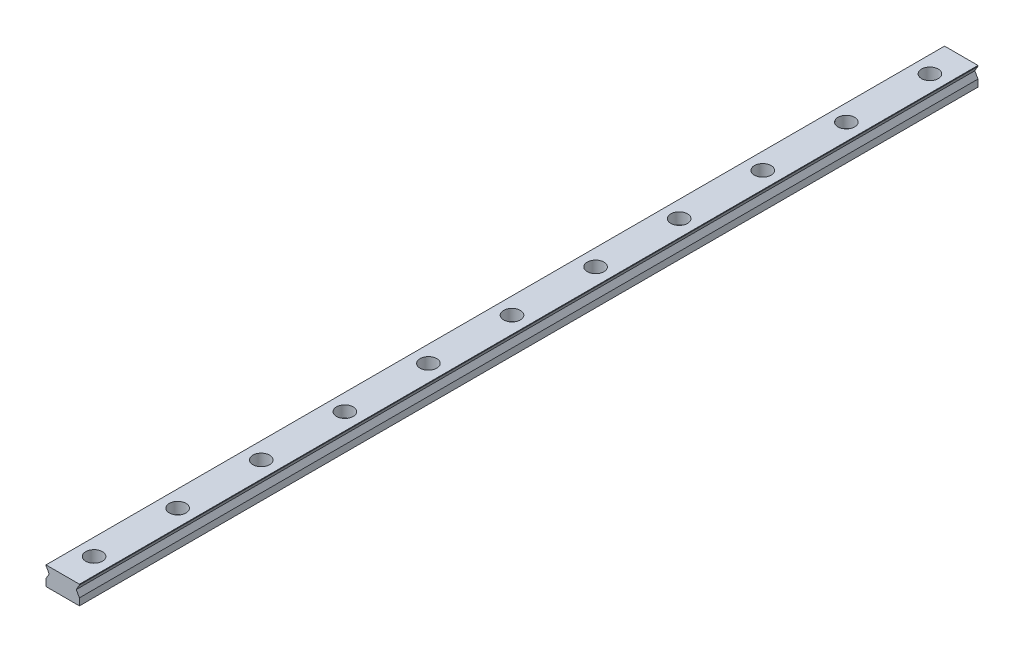
ISO-10303-21;
HEADER;
FILE_DESCRIPTION(('STEP AP214'),'2;1');
FILE_NAME('part.step','',(''),(''),'','','');
FILE_SCHEMA(('AUTOMOTIVE_DESIGN { 1 0 10303 214 1 1 1 1 }'));
ENDSEC;
DATA;
#1=APPLICATION_CONTEXT('core data for automotive mechanical design processes');
#2=APPLICATION_PROTOCOL_DEFINITION('international standard','automotive_design',2000,#1);
#3=PRODUCT_CONTEXT('',#1,'mechanical');
#4=PRODUCT('Part','Part','',(#3));
#5=PRODUCT_RELATED_PRODUCT_CATEGORY('part','',(#4));
#6=PRODUCT_DEFINITION_FORMATION('','',#4);
#7=PRODUCT_DEFINITION_CONTEXT('part definition',#1,'design');
#8=PRODUCT_DEFINITION('design','',#6,#7);
#9=PRODUCT_DEFINITION_SHAPE('','',#8);
#10=(LENGTH_UNIT() NAMED_UNIT(*) SI_UNIT(.MILLI.,.METRE.));
#11=(NAMED_UNIT(*) PLANE_ANGLE_UNIT() SI_UNIT($,.RADIAN.));
#12=(NAMED_UNIT(*) SI_UNIT($,.STERADIAN.) SOLID_ANGLE_UNIT());
#13=UNCERTAINTY_MEASURE_WITH_UNIT(LENGTH_MEASURE(1.E-05),#10,'distance_accuracy_value','');
#14=(GEOMETRIC_REPRESENTATION_CONTEXT(3) GLOBAL_UNCERTAINTY_ASSIGNED_CONTEXT((#13)) GLOBAL_UNIT_ASSIGNED_CONTEXT((#10,
#11,#12)) REPRESENTATION_CONTEXT('',''));
#15=CARTESIAN_POINT('',(0.,0.,0.));
#16=DIRECTION('',(0.,0.,1.));
#17=DIRECTION('',(1.,0.,0.));
#18=AXIS2_PLACEMENT_3D('',#15,#16,#17);
#19=CARTESIAN_POINT('',(-8.,0.,430.));
#20=DIRECTION('',(0.,1.,0.));
#21=DIRECTION('',(0.,0.,1.));
#22=AXIS2_PLACEMENT_3D('',#19,#20,#21);
#23=PLANE('',#22);
#24=CARTESIAN_POINT('',(0.,0.,375.));
#25=DIRECTION('',(0.,1.,0.));
#26=DIRECTION('',(0.,0.,1.));
#27=AXIS2_PLACEMENT_3D('',#24,#25,#26);
#28=CIRCLE('',#27,2.25);
#29=CARTESIAN_POINT('',(0.,0.,377.25));
#30=VERTEX_POINT('',#29);
#31=EDGE_CURVE('E325',#30,#30,#28,.T.);
#32=ORIENTED_EDGE('',*,*,#31,.T.);
#33=EDGE_LOOP('',(#32));
#34=FACE_BOUND('',#33,.T.);
#35=CARTESIAN_POINT('',(0.,0.,295.));
#36=DIRECTION('',(0.,1.,0.));
#37=DIRECTION('',(0.,0.,1.));
#38=AXIS2_PLACEMENT_3D('',#35,#36,#37);
#39=CIRCLE('',#38,2.25);
#40=CARTESIAN_POINT('',(0.,0.,297.25));
#41=VERTEX_POINT('',#40);
#42=EDGE_CURVE('E301',#41,#41,#39,.T.);
#43=ORIENTED_EDGE('',*,*,#42,.T.);
#44=EDGE_LOOP('',(#43));
#45=FACE_BOUND('',#44,.T.);
#46=CARTESIAN_POINT('',(0.,0.,215.));
#47=DIRECTION('',(0.,1.,0.));
#48=DIRECTION('',(0.,0.,1.));
#49=AXIS2_PLACEMENT_3D('',#46,#47,#48);
#50=CIRCLE('',#49,2.25);
#51=CARTESIAN_POINT('',(0.,0.,217.25));
#52=VERTEX_POINT('',#51);
#53=EDGE_CURVE('E277',#52,#52,#50,.T.);
#54=ORIENTED_EDGE('',*,*,#53,.T.);
#55=EDGE_LOOP('',(#54));
#56=FACE_BOUND('',#55,.T.);
#57=CARTESIAN_POINT('',(0.,0.,135.));
#58=DIRECTION('',(0.,1.,0.));
#59=DIRECTION('',(0.,0.,1.));
#60=AXIS2_PLACEMENT_3D('',#57,#58,#59);
#61=CIRCLE('',#60,2.25);
#62=CARTESIAN_POINT('',(0.,0.,137.25));
#63=VERTEX_POINT('',#62);
#64=EDGE_CURVE('E253',#63,#63,#61,.T.);
#65=ORIENTED_EDGE('',*,*,#64,.T.);
#66=EDGE_LOOP('',(#65));
#67=FACE_BOUND('',#66,.T.);
#68=CARTESIAN_POINT('',(0.,0.,55.));
#69=DIRECTION('',(0.,1.,0.));
#70=DIRECTION('',(0.,0.,1.));
#71=AXIS2_PLACEMENT_3D('',#68,#69,#70);
#72=CIRCLE('',#71,2.25);
#73=CARTESIAN_POINT('',(0.,0.,57.25));
#74=VERTEX_POINT('',#73);
#75=EDGE_CURVE('E229',#74,#74,#72,.T.);
#76=ORIENTED_EDGE('',*,*,#75,.T.);
#77=EDGE_LOOP('',(#76));
#78=FACE_BOUND('',#77,.T.);
#79=DIRECTION('',(1.,0.,0.));
#80=VECTOR('',#79,1.);
#81=CARTESIAN_POINT('',(-8.,0.,0.));
#82=LINE('',#81,#80);
#83=CARTESIAN_POINT('',(-8.,0.,0.));
#84=VERTEX_POINT('',#83);
#85=CARTESIAN_POINT('',(8.,0.,0.));
#86=VERTEX_POINT('',#85);
#87=EDGE_CURVE('E146',#84,#86,#82,.T.);
#88=ORIENTED_EDGE('',*,*,#87,.T.);
#89=DIRECTION('',(0.,0.,-1.));
#90=VECTOR('',#89,1.);
#91=CARTESIAN_POINT('',(8.,0.,430.));
#92=LINE('',#91,#90);
#93=CARTESIAN_POINT('',(8.,0.,430.));
#94=VERTEX_POINT('',#93);
#95=EDGE_CURVE('E43',#94,#86,#92,.T.);
#96=ORIENTED_EDGE('',*,*,#95,.F.);
#97=DIRECTION('',(1.,0.,0.));
#98=VECTOR('',#97,1.);
#99=CARTESIAN_POINT('',(-8.,0.,430.));
#100=LINE('',#99,#98);
#101=CARTESIAN_POINT('',(-8.,0.,430.));
#102=VERTEX_POINT('',#101);
#103=EDGE_CURVE('E100',#102,#94,#100,.T.);
#104=ORIENTED_EDGE('',*,*,#103,.F.);
#105=DIRECTION('',(0.,0.,-1.));
#106=VECTOR('',#105,1.);
#107=CARTESIAN_POINT('',(-8.,0.,430.));
#108=LINE('',#107,#106);
#109=EDGE_CURVE('E11',#102,#84,#108,.T.);
#110=ORIENTED_EDGE('',*,*,#109,.T.);
#111=EDGE_LOOP('',(#88,#96,#104,#110));
#112=FACE_BOUND('',#111,.T.);
#113=CARTESIAN_POINT('',(0.,0.,15.));
#114=DIRECTION('',(0.,1.,0.));
#115=DIRECTION('',(0.,0.,1.));
#116=AXIS2_PLACEMENT_3D('',#113,#114,#115);
#117=CIRCLE('',#116,2.25);
#118=CARTESIAN_POINT('',(0.,0.,17.25));
#119=VERTEX_POINT('',#118);
#120=EDGE_CURVE('E217',#119,#119,#117,.T.);
#121=ORIENTED_EDGE('',*,*,#120,.T.);
#122=EDGE_LOOP('',(#121));
#123=FACE_BOUND('',#122,.T.);
#124=CARTESIAN_POINT('',(0.,0.,95.));
#125=DIRECTION('',(0.,1.,0.));
#126=DIRECTION('',(0.,0.,1.));
#127=AXIS2_PLACEMENT_3D('',#124,#125,#126);
#128=CIRCLE('',#127,2.25);
#129=CARTESIAN_POINT('',(0.,0.,97.25));
#130=VERTEX_POINT('',#129);
#131=EDGE_CURVE('E241',#130,#130,#128,.T.);
#132=ORIENTED_EDGE('',*,*,#131,.T.);
#133=EDGE_LOOP('',(#132));
#134=FACE_BOUND('',#133,.T.);
#135=CARTESIAN_POINT('',(0.,0.,175.));
#136=DIRECTION('',(0.,1.,0.));
#137=DIRECTION('',(0.,0.,1.));
#138=AXIS2_PLACEMENT_3D('',#135,#136,#137);
#139=CIRCLE('',#138,2.25);
#140=CARTESIAN_POINT('',(0.,0.,177.25));
#141=VERTEX_POINT('',#140);
#142=EDGE_CURVE('E265',#141,#141,#139,.T.);
#143=ORIENTED_EDGE('',*,*,#142,.T.);
#144=EDGE_LOOP('',(#143));
#145=FACE_BOUND('',#144,.T.);
#146=CARTESIAN_POINT('',(0.,0.,255.));
#147=DIRECTION('',(0.,1.,0.));
#148=DIRECTION('',(0.,0.,1.));
#149=AXIS2_PLACEMENT_3D('',#146,#147,#148);
#150=CIRCLE('',#149,2.25);
#151=CARTESIAN_POINT('',(0.,0.,257.25));
#152=VERTEX_POINT('',#151);
#153=EDGE_CURVE('E289',#152,#152,#150,.T.);
#154=ORIENTED_EDGE('',*,*,#153,.T.);
#155=EDGE_LOOP('',(#154));
#156=FACE_BOUND('',#155,.T.);
#157=CARTESIAN_POINT('',(0.,0.,335.));
#158=DIRECTION('',(0.,1.,0.));
#159=DIRECTION('',(0.,0.,1.));
#160=AXIS2_PLACEMENT_3D('',#157,#158,#159);
#161=CIRCLE('',#160,2.25);
#162=CARTESIAN_POINT('',(0.,0.,337.25));
#163=VERTEX_POINT('',#162);
#164=EDGE_CURVE('E313',#163,#163,#161,.T.);
#165=ORIENTED_EDGE('',*,*,#164,.T.);
#166=EDGE_LOOP('',(#165));
#167=FACE_BOUND('',#166,.T.);
#168=CARTESIAN_POINT('',(0.,0.,415.));
#169=DIRECTION('',(0.,1.,0.));
#170=DIRECTION('',(0.,0.,1.));
#171=AXIS2_PLACEMENT_3D('',#168,#169,#170);
#172=CIRCLE('',#171,2.25);
#173=CARTESIAN_POINT('',(0.,0.,417.25));
#174=VERTEX_POINT('',#173);
#175=EDGE_CURVE('E337',#174,#174,#172,.T.);
#176=ORIENTED_EDGE('',*,*,#175,.T.);
#177=EDGE_LOOP('',(#176));
#178=FACE_BOUND('',#177,.T.);
#179=ADVANCED_FACE('F34',(#34,#45,#56,#67,#78,#112,#123,#134,#145,#156,#167,#178),#23,.F.);
#180=CARTESIAN_POINT('',(8.,9.,430.));
#181=DIRECTION('',(0.,-1.,0.));
#182=DIRECTION('',(0.,0.,-1.));
#183=AXIS2_PLACEMENT_3D('',#180,#181,#182);
#184=PLANE('',#183);
#185=CARTESIAN_POINT('',(0.,9.,375.));
#186=DIRECTION('',(0.,1.,0.));
#187=DIRECTION('',(0.,0.,1.));
#188=AXIS2_PLACEMENT_3D('',#185,#186,#187);
#189=CIRCLE('',#188,4.);
#190=CARTESIAN_POINT('',(0.,9.,379.));
#191=VERTEX_POINT('',#190);
#192=EDGE_CURVE('E316',#191,#191,#189,.T.);
#193=ORIENTED_EDGE('',*,*,#192,.F.);
#194=EDGE_LOOP('',(#193));
#195=FACE_BOUND('',#194,.T.);
#196=CARTESIAN_POINT('',(0.,9.,295.));
#197=DIRECTION('',(0.,1.,0.));
#198=DIRECTION('',(0.,0.,1.));
#199=AXIS2_PLACEMENT_3D('',#196,#197,#198);
#200=CIRCLE('',#199,4.);
#201=CARTESIAN_POINT('',(0.,9.,299.));
#202=VERTEX_POINT('',#201);
#203=EDGE_CURVE('E292',#202,#202,#200,.T.);
#204=ORIENTED_EDGE('',*,*,#203,.F.);
#205=EDGE_LOOP('',(#204));
#206=FACE_BOUND('',#205,.T.);
#207=CARTESIAN_POINT('',(0.,9.,215.));
#208=DIRECTION('',(0.,1.,0.));
#209=DIRECTION('',(0.,0.,1.));
#210=AXIS2_PLACEMENT_3D('',#207,#208,#209);
#211=CIRCLE('',#210,4.);
#212=CARTESIAN_POINT('',(0.,9.,219.));
#213=VERTEX_POINT('',#212);
#214=EDGE_CURVE('E268',#213,#213,#211,.T.);
#215=ORIENTED_EDGE('',*,*,#214,.F.);
#216=EDGE_LOOP('',(#215));
#217=FACE_BOUND('',#216,.T.);
#218=CARTESIAN_POINT('',(0.,9.,135.));
#219=DIRECTION('',(0.,1.,0.));
#220=DIRECTION('',(0.,0.,1.));
#221=AXIS2_PLACEMENT_3D('',#218,#219,#220);
#222=CIRCLE('',#221,4.);
#223=CARTESIAN_POINT('',(0.,9.,139.));
#224=VERTEX_POINT('',#223);
#225=EDGE_CURVE('E244',#224,#224,#222,.T.);
#226=ORIENTED_EDGE('',*,*,#225,.F.);
#227=EDGE_LOOP('',(#226));
#228=FACE_BOUND('',#227,.T.);
#229=CARTESIAN_POINT('',(0.,9.,55.));
#230=DIRECTION('',(0.,1.,0.));
#231=DIRECTION('',(0.,0.,1.));
#232=AXIS2_PLACEMENT_3D('',#229,#230,#231);
#233=CIRCLE('',#232,4.);
#234=CARTESIAN_POINT('',(0.,9.,59.));
#235=VERTEX_POINT('',#234);
#236=EDGE_CURVE('E220',#235,#235,#233,.T.);
#237=ORIENTED_EDGE('',*,*,#236,.F.);
#238=EDGE_LOOP('',(#237));
#239=FACE_BOUND('',#238,.T.);
#240=DIRECTION('',(-1.,0.,0.));
#241=VECTOR('',#240,1.);
#242=CARTESIAN_POINT('',(8.,9.,0.));
#243=LINE('',#242,#241);
#244=CARTESIAN_POINT('',(8.,9.,0.));
#245=VERTEX_POINT('',#244);
#246=CARTESIAN_POINT('',(-8.,9.,0.));
#247=VERTEX_POINT('',#246);
#248=EDGE_CURVE('E157',#245,#247,#243,.T.);
#249=ORIENTED_EDGE('',*,*,#248,.T.);
#250=DIRECTION('',(0.,0.,-1.));
#251=VECTOR('',#250,1.);
#252=CARTESIAN_POINT('',(-8.,9.,430.));
#253=LINE('',#252,#251);
#254=CARTESIAN_POINT('',(-8.,9.,430.));
#255=VERTEX_POINT('',#254);
#256=EDGE_CURVE('E134',#255,#247,#253,.T.);
#257=ORIENTED_EDGE('',*,*,#256,.F.);
#258=DIRECTION('',(-1.,0.,0.));
#259=VECTOR('',#258,1.);
#260=CARTESIAN_POINT('',(8.,9.,430.));
#261=LINE('',#260,#259);
#262=CARTESIAN_POINT('',(8.,9.,430.));
#263=VERTEX_POINT('',#262);
#264=EDGE_CURVE('E125',#263,#255,#261,.T.);
#265=ORIENTED_EDGE('',*,*,#264,.F.);
#266=DIRECTION('',(0.,0.,-1.));
#267=VECTOR('',#266,1.);
#268=CARTESIAN_POINT('',(8.,9.,430.));
#269=LINE('',#268,#267);
#270=EDGE_CURVE('E166',#263,#245,#269,.T.);
#271=ORIENTED_EDGE('',*,*,#270,.T.);
#272=EDGE_LOOP('',(#249,#257,#265,#271));
#273=FACE_BOUND('',#272,.T.);
#274=CARTESIAN_POINT('',(0.,9.,15.));
#275=DIRECTION('',(0.,1.,0.));
#276=DIRECTION('',(0.,0.,1.));
#277=AXIS2_PLACEMENT_3D('',#274,#275,#276);
#278=CIRCLE('',#277,4.);
#279=CARTESIAN_POINT('',(0.,9.,19.));
#280=VERTEX_POINT('',#279);
#281=EDGE_CURVE('E147',#280,#280,#278,.T.);
#282=ORIENTED_EDGE('',*,*,#281,.F.);
#283=EDGE_LOOP('',(#282));
#284=FACE_BOUND('',#283,.T.);
#285=CARTESIAN_POINT('',(0.,9.,95.));
#286=DIRECTION('',(0.,1.,0.));
#287=DIRECTION('',(0.,0.,1.));
#288=AXIS2_PLACEMENT_3D('',#285,#286,#287);
#289=CIRCLE('',#288,4.);
#290=CARTESIAN_POINT('',(0.,9.,99.));
#291=VERTEX_POINT('',#290);
#292=EDGE_CURVE('E232',#291,#291,#289,.T.);
#293=ORIENTED_EDGE('',*,*,#292,.F.);
#294=EDGE_LOOP('',(#293));
#295=FACE_BOUND('',#294,.T.);
#296=CARTESIAN_POINT('',(0.,9.,175.));
#297=DIRECTION('',(0.,1.,0.));
#298=DIRECTION('',(0.,0.,1.));
#299=AXIS2_PLACEMENT_3D('',#296,#297,#298);
#300=CIRCLE('',#299,4.);
#301=CARTESIAN_POINT('',(0.,9.,179.));
#302=VERTEX_POINT('',#301);
#303=EDGE_CURVE('E256',#302,#302,#300,.T.);
#304=ORIENTED_EDGE('',*,*,#303,.F.);
#305=EDGE_LOOP('',(#304));
#306=FACE_BOUND('',#305,.T.);
#307=CARTESIAN_POINT('',(0.,9.,255.));
#308=DIRECTION('',(0.,1.,0.));
#309=DIRECTION('',(0.,0.,1.));
#310=AXIS2_PLACEMENT_3D('',#307,#308,#309);
#311=CIRCLE('',#310,4.);
#312=CARTESIAN_POINT('',(0.,9.,259.));
#313=VERTEX_POINT('',#312);
#314=EDGE_CURVE('E280',#313,#313,#311,.T.);
#315=ORIENTED_EDGE('',*,*,#314,.F.);
#316=EDGE_LOOP('',(#315));
#317=FACE_BOUND('',#316,.T.);
#318=CARTESIAN_POINT('',(0.,9.,335.));
#319=DIRECTION('',(0.,1.,0.));
#320=DIRECTION('',(0.,0.,1.));
#321=AXIS2_PLACEMENT_3D('',#318,#319,#320);
#322=CIRCLE('',#321,4.);
#323=CARTESIAN_POINT('',(0.,9.,339.));
#324=VERTEX_POINT('',#323);
#325=EDGE_CURVE('E304',#324,#324,#322,.T.);
#326=ORIENTED_EDGE('',*,*,#325,.F.);
#327=EDGE_LOOP('',(#326));
#328=FACE_BOUND('',#327,.T.);
#329=CARTESIAN_POINT('',(0.,9.,415.));
#330=DIRECTION('',(0.,1.,0.));
#331=DIRECTION('',(0.,0.,1.));
#332=AXIS2_PLACEMENT_3D('',#329,#330,#331);
#333=CIRCLE('',#332,4.);
#334=CARTESIAN_POINT('',(0.,9.,419.));
#335=VERTEX_POINT('',#334);
#336=EDGE_CURVE('E328',#335,#335,#333,.T.);
#337=ORIENTED_EDGE('',*,*,#336,.F.);
#338=EDGE_LOOP('',(#337));
#339=FACE_BOUND('',#338,.T.);
#340=ADVANCED_FACE('F354',(#195,#206,#217,#228,#239,#273,#284,#295,#306,#317,#328,#339),#184,.F.);
#341=CARTESIAN_POINT('',(-8.,3.35,430.));
#342=DIRECTION('',(1.,0.,0.));
#343=DIRECTION('',(0.,0.,-1.));
#344=AXIS2_PLACEMENT_3D('',#341,#342,#343);
#345=PLANE('',#344);
#346=DIRECTION('',(0.,-1.,0.));
#347=VECTOR('',#346,1.);
#348=CARTESIAN_POINT('',(-8.,3.35,0.));
#349=LINE('',#348,#347);
#350=CARTESIAN_POINT('',(-8.,3.35,0.));
#351=VERTEX_POINT('',#350);
#352=EDGE_CURVE('E143',#351,#84,#349,.T.);
#353=ORIENTED_EDGE('',*,*,#352,.T.);
#354=ORIENTED_EDGE('',*,*,#109,.F.);
#355=DIRECTION('',(0.,-1.,0.));
#356=VECTOR('',#355,1.);
#357=CARTESIAN_POINT('',(-8.,3.35,430.));
#358=LINE('',#357,#356);
#359=CARTESIAN_POINT('',(-8.,3.35,430.));
#360=VERTEX_POINT('',#359);
#361=EDGE_CURVE('E162',#360,#102,#358,.T.);
#362=ORIENTED_EDGE('',*,*,#361,.F.);
#363=DIRECTION('',(0.,0.,-1.));
#364=VECTOR('',#363,1.);
#365=CARTESIAN_POINT('',(-8.,3.35,430.));
#366=LINE('',#365,#364);
#367=EDGE_CURVE('E139',#360,#351,#366,.T.);
#368=ORIENTED_EDGE('',*,*,#367,.T.);
#369=EDGE_LOOP('',(#353,#354,#362,#368));
#370=FACE_BOUND('',#369,.T.);
#371=ADVANCED_FACE('F36',(#370),#345,.F.);
#372=CARTESIAN_POINT('',(8.,0.,430.));
#373=DIRECTION('',(-1.,0.,0.));
#374=DIRECTION('',(0.,0.,1.));
#375=AXIS2_PLACEMENT_3D('',#372,#373,#374);
#376=PLANE('',#375);
#377=DIRECTION('',(0.,1.,0.));
#378=VECTOR('',#377,1.);
#379=CARTESIAN_POINT('',(8.,0.,0.));
#380=LINE('',#379,#378);
#381=CARTESIAN_POINT('',(8.,3.35,0.));
#382=VERTEX_POINT('',#381);
#383=EDGE_CURVE('E149',#86,#382,#380,.T.);
#384=ORIENTED_EDGE('',*,*,#383,.T.);
#385=DIRECTION('',(0.,0.,-1.));
#386=VECTOR('',#385,1.);
#387=CARTESIAN_POINT('',(8.,3.35,430.));
#388=LINE('',#387,#386);
#389=CARTESIAN_POINT('',(8.,3.35,430.));
#390=VERTEX_POINT('',#389);
#391=EDGE_CURVE('E175',#390,#382,#388,.T.);
#392=ORIENTED_EDGE('',*,*,#391,.F.);
#393=DIRECTION('',(0.,1.,0.));
#394=VECTOR('',#393,1.);
#395=CARTESIAN_POINT('',(8.,0.,430.));
#396=LINE('',#395,#394);
#397=EDGE_CURVE('E183',#94,#390,#396,.T.);
#398=ORIENTED_EDGE('',*,*,#397,.F.);
#399=ORIENTED_EDGE('',*,*,#95,.T.);
#400=EDGE_LOOP('',(#384,#392,#398,#399));
#401=FACE_BOUND('',#400,.T.);
#402=ADVANCED_FACE('F181',(#401),#376,.F.);
#403=CARTESIAN_POINT('',(8.,3.35,430.));
#404=DIRECTION('',(-0.866022320762797,-0.500005339912105,0.));
#405=DIRECTION('',(0.500005339912105,-0.866022320762797,0.));
#406=AXIS2_PLACEMENT_3D('',#403,#404,#405);
#407=PLANE('',#406);
#408=DIRECTION('',(-0.500005339912105,0.866022320762797,0.));
#409=VECTOR('',#408,1.);
#410=CARTESIAN_POINT('',(8.,3.35,0.));
#411=LINE('',#410,#409);
#412=CARTESIAN_POINT('',(6.47,6.,0.));
#413=VERTEX_POINT('',#412);
#414=EDGE_CURVE('E151',#382,#413,#411,.T.);
#415=ORIENTED_EDGE('',*,*,#414,.T.);
#416=DIRECTION('',(0.,0.,-1.));
#417=VECTOR('',#416,1.);
#418=CARTESIAN_POINT('',(6.47,6.,430.));
#419=LINE('',#418,#417);
#420=CARTESIAN_POINT('',(6.47,6.,430.));
#421=VERTEX_POINT('',#420);
#422=EDGE_CURVE('E172',#421,#413,#419,.T.);
#423=ORIENTED_EDGE('',*,*,#422,.F.);
#424=DIRECTION('',(-0.500005339912105,0.866022320762797,0.));
#425=VECTOR('',#424,1.);
#426=CARTESIAN_POINT('',(8.,3.35,430.));
#427=LINE('',#426,#425);
#428=EDGE_CURVE('E201',#390,#421,#427,.T.);
#429=ORIENTED_EDGE('',*,*,#428,.F.);
#430=ORIENTED_EDGE('',*,*,#391,.T.);
#431=EDGE_LOOP('',(#415,#423,#429,#430));
#432=FACE_BOUND('',#431,.T.);
#433=ADVANCED_FACE('F192',(#432),#407,.F.);
#434=CARTESIAN_POINT('',(6.47,6.,430.));
#435=DIRECTION('',(-0.866022320762797,0.500005339912105,0.));
#436=DIRECTION('',(-0.500005339912105,-0.866022320762797,0.));
#437=AXIS2_PLACEMENT_3D('',#434,#435,#436);
#438=PLANE('',#437);
#439=DIRECTION('',(0.500005339912105,0.866022320762797,0.));
#440=VECTOR('',#439,1.);
#441=CARTESIAN_POINT('',(6.47,6.,0.));
#442=LINE('',#441,#440);
#443=CARTESIAN_POINT('',(8.,8.65,0.));
#444=VERTEX_POINT('',#443);
#445=EDGE_CURVE('E153',#413,#444,#442,.T.);
#446=ORIENTED_EDGE('',*,*,#445,.T.);
#447=DIRECTION('',(0.,0.,-1.));
#448=VECTOR('',#447,1.);
#449=CARTESIAN_POINT('',(8.,8.65,430.));
#450=LINE('',#449,#448);
#451=CARTESIAN_POINT('',(8.,8.65,430.));
#452=VERTEX_POINT('',#451);
#453=EDGE_CURVE('E169',#452,#444,#450,.T.);
#454=ORIENTED_EDGE('',*,*,#453,.F.);
#455=DIRECTION('',(0.500005339912105,0.866022320762797,0.));
#456=VECTOR('',#455,1.);
#457=CARTESIAN_POINT('',(6.47,6.,430.));
#458=LINE('',#457,#456);
#459=EDGE_CURVE('E198',#421,#452,#458,.T.);
#460=ORIENTED_EDGE('',*,*,#459,.F.);
#461=ORIENTED_EDGE('',*,*,#422,.T.);
#462=EDGE_LOOP('',(#446,#454,#460,#461));
#463=FACE_BOUND('',#462,.T.);
#464=ADVANCED_FACE('F196',(#463),#438,.F.);
#465=CARTESIAN_POINT('',(8.,8.65,430.));
#466=DIRECTION('',(-1.,0.,0.));
#467=DIRECTION('',(0.,0.,1.));
#468=AXIS2_PLACEMENT_3D('',#465,#466,#467);
#469=PLANE('',#468);
#470=DIRECTION('',(0.,1.,0.));
#471=VECTOR('',#470,1.);
#472=CARTESIAN_POINT('',(8.,8.65,0.));
#473=LINE('',#472,#471);
#474=EDGE_CURVE('E155',#444,#245,#473,.T.);
#475=ORIENTED_EDGE('',*,*,#474,.T.);
#476=ORIENTED_EDGE('',*,*,#270,.F.);
#477=DIRECTION('',(0.,1.,0.));
#478=VECTOR('',#477,1.);
#479=CARTESIAN_POINT('',(8.,8.65,430.));
#480=LINE('',#479,#478);
#481=EDGE_CURVE('E200',#452,#263,#480,.T.);
#482=ORIENTED_EDGE('',*,*,#481,.F.);
#483=ORIENTED_EDGE('',*,*,#453,.T.);
#484=EDGE_LOOP('',(#475,#476,#482,#483));
#485=FACE_BOUND('',#484,.T.);
#486=ADVANCED_FACE('F369',(#485),#469,.F.);
#487=CARTESIAN_POINT('',(-8.,9.,430.));
#488=DIRECTION('',(1.,0.,0.));
#489=DIRECTION('',(0.,0.,-1.));
#490=AXIS2_PLACEMENT_3D('',#487,#488,#489);
#491=PLANE('',#490);
#492=DIRECTION('',(0.,-1.,0.));
#493=VECTOR('',#492,1.);
#494=CARTESIAN_POINT('',(-8.,9.,0.));
#495=LINE('',#494,#493);
#496=CARTESIAN_POINT('',(-8.,8.65,0.));
#497=VERTEX_POINT('',#496);
#498=EDGE_CURVE('E133',#247,#497,#495,.T.);
#499=ORIENTED_EDGE('',*,*,#498,.T.);
#500=DIRECTION('',(0.,0.,-1.));
#501=VECTOR('',#500,1.);
#502=CARTESIAN_POINT('',(-8.,8.65,430.));
#503=LINE('',#502,#501);
#504=CARTESIAN_POINT('',(-8.,8.65,430.));
#505=VERTEX_POINT('',#504);
#506=EDGE_CURVE('E130',#505,#497,#503,.T.);
#507=ORIENTED_EDGE('',*,*,#506,.F.);
#508=DIRECTION('',(0.,-1.,0.));
#509=VECTOR('',#508,1.);
#510=CARTESIAN_POINT('',(-8.,9.,430.));
#511=LINE('',#510,#509);
#512=EDGE_CURVE('E119',#255,#505,#511,.T.);
#513=ORIENTED_EDGE('',*,*,#512,.F.);
#514=ORIENTED_EDGE('',*,*,#256,.T.);
#515=EDGE_LOOP('',(#499,#507,#513,#514));
#516=FACE_BOUND('',#515,.T.);
#517=ADVANCED_FACE('F131',(#516),#491,.F.);
#518=CARTESIAN_POINT('',(-8.,8.65,430.));
#519=DIRECTION('',(0.866022320762797,0.500005339912105,0.));
#520=DIRECTION('',(-0.500005339912105,0.866022320762797,0.));
#521=AXIS2_PLACEMENT_3D('',#518,#519,#520);
#522=PLANE('',#521);
#523=DIRECTION('',(0.500005339912105,-0.866022320762797,0.));
#524=VECTOR('',#523,1.);
#525=CARTESIAN_POINT('',(-8.,8.65,0.));
#526=LINE('',#525,#524);
#527=CARTESIAN_POINT('',(-6.47,6.,0.));
#528=VERTEX_POINT('',#527);
#529=EDGE_CURVE('E86',#497,#528,#526,.T.);
#530=ORIENTED_EDGE('',*,*,#529,.T.);
#531=DIRECTION('',(0.,0.,-1.));
#532=VECTOR('',#531,1.);
#533=CARTESIAN_POINT('',(-6.47,6.,430.));
#534=LINE('',#533,#532);
#535=CARTESIAN_POINT('',(-6.47,6.,430.));
#536=VERTEX_POINT('',#535);
#537=EDGE_CURVE('E135',#536,#528,#534,.T.);
#538=ORIENTED_EDGE('',*,*,#537,.F.);
#539=DIRECTION('',(0.500005339912105,-0.866022320762797,0.));
#540=VECTOR('',#539,1.);
#541=CARTESIAN_POINT('',(-8.,8.65,430.));
#542=LINE('',#541,#540);
#543=EDGE_CURVE('E123',#505,#536,#542,.T.);
#544=ORIENTED_EDGE('',*,*,#543,.F.);
#545=ORIENTED_EDGE('',*,*,#506,.T.);
#546=EDGE_LOOP('',(#530,#538,#544,#545));
#547=FACE_BOUND('',#546,.T.);
#548=ADVANCED_FACE('F137',(#547),#522,.F.);
#549=CARTESIAN_POINT('',(-6.47,6.,430.));
#550=DIRECTION('',(0.866022320762797,-0.500005339912105,0.));
#551=DIRECTION('',(0.500005339912105,0.866022320762797,0.));
#552=AXIS2_PLACEMENT_3D('',#549,#550,#551);
#553=PLANE('',#552);
#554=DIRECTION('',(-0.500005339912105,-0.866022320762797,0.));
#555=VECTOR('',#554,1.);
#556=CARTESIAN_POINT('',(-6.47,6.,0.));
#557=LINE('',#556,#555);
#558=EDGE_CURVE('E92',#528,#351,#557,.T.);
#559=ORIENTED_EDGE('',*,*,#558,.T.);
#560=ORIENTED_EDGE('',*,*,#367,.F.);
#561=DIRECTION('',(-0.500005339912105,-0.866022320762797,0.));
#562=VECTOR('',#561,1.);
#563=CARTESIAN_POINT('',(-6.47,6.,430.));
#564=LINE('',#563,#562);
#565=EDGE_CURVE('E51',#536,#360,#564,.T.);
#566=ORIENTED_EDGE('',*,*,#565,.F.);
#567=ORIENTED_EDGE('',*,*,#537,.T.);
#568=EDGE_LOOP('',(#559,#560,#566,#567));
#569=FACE_BOUND('',#568,.T.);
#570=ADVANCED_FACE('F377',(#569),#553,.F.);
#571=CARTESIAN_POINT('',(0.,0.,430.));
#572=DIRECTION('',(0.,0.,1.));
#573=DIRECTION('',(1.,0.,0.));
#574=AXIS2_PLACEMENT_3D('',#571,#572,#573);
#575=PLANE('',#574);
#576=ORIENTED_EDGE('',*,*,#361,.T.);
#577=ORIENTED_EDGE('',*,*,#103,.T.);
#578=ORIENTED_EDGE('',*,*,#397,.T.);
#579=ORIENTED_EDGE('',*,*,#428,.T.);
#580=ORIENTED_EDGE('',*,*,#459,.T.);
#581=ORIENTED_EDGE('',*,*,#481,.T.);
#582=ORIENTED_EDGE('',*,*,#264,.T.);
#583=ORIENTED_EDGE('',*,*,#512,.T.);
#584=ORIENTED_EDGE('',*,*,#543,.T.);
#585=ORIENTED_EDGE('',*,*,#565,.T.);
#586=EDGE_LOOP('',(#576,#577,#578,#579,#580,#581,#582,#583,#584,#585));
#587=FACE_BOUND('',#586,.T.);
#588=ADVANCED_FACE('F121',(#587),#575,.T.);
#589=CARTESIAN_POINT('',(0.,0.,0.));
#590=DIRECTION('',(0.,0.,1.));
#591=DIRECTION('',(1.,0.,0.));
#592=AXIS2_PLACEMENT_3D('',#589,#590,#591);
#593=PLANE('',#592);
#594=ORIENTED_EDGE('',*,*,#352,.F.);
#595=ORIENTED_EDGE('',*,*,#558,.F.);
#596=ORIENTED_EDGE('',*,*,#529,.F.);
#597=ORIENTED_EDGE('',*,*,#498,.F.);
#598=ORIENTED_EDGE('',*,*,#248,.F.);
#599=ORIENTED_EDGE('',*,*,#474,.F.);
#600=ORIENTED_EDGE('',*,*,#445,.F.);
#601=ORIENTED_EDGE('',*,*,#414,.F.);
#602=ORIENTED_EDGE('',*,*,#383,.F.);
#603=ORIENTED_EDGE('',*,*,#87,.F.);
#604=EDGE_LOOP('',(#594,#595,#596,#597,#598,#599,#600,#601,#602,#603));
#605=FACE_BOUND('',#604,.T.);
#606=ADVANCED_FACE('F187',(#605),#593,.F.);
#607=CARTESIAN_POINT('',(0.,0.,15.));
#608=DIRECTION('',(0.,1.,0.));
#609=DIRECTION('',(0.,0.,1.));
#610=AXIS2_PLACEMENT_3D('',#607,#608,#609);
#611=CYLINDRICAL_SURFACE('',#610,4.);
#612=ORIENTED_EDGE('',*,*,#281,.T.);
#613=EDGE_LOOP('',(#612));
#614=FACE_BOUND('',#613,.T.);
#615=CARTESIAN_POINT('',(0.,3.5,15.));
#616=DIRECTION('',(0.,1.,0.));
#617=DIRECTION('',(0.,0.,1.));
#618=AXIS2_PLACEMENT_3D('',#615,#616,#617);
#619=CIRCLE('',#618,4.);
#620=CARTESIAN_POINT('',(0.,3.5,19.));
#621=VERTEX_POINT('',#620);
#622=EDGE_CURVE('E211',#621,#621,#619,.T.);
#623=ORIENTED_EDGE('',*,*,#622,.F.);
#624=EDGE_LOOP('',(#623));
#625=FACE_BOUND('',#624,.T.);
#626=ADVANCED_FACE('F382',(#614,#625),#611,.F.);
#627=CARTESIAN_POINT('',(4.,3.5,15.));
#628=DIRECTION('',(0.,1.,0.));
#629=DIRECTION('',(0.,0.,1.));
#630=AXIS2_PLACEMENT_3D('',#627,#628,#629);
#631=PLANE('',#630);
#632=ORIENTED_EDGE('',*,*,#622,.T.);
#633=EDGE_LOOP('',(#632));
#634=FACE_BOUND('',#633,.T.);
#635=CARTESIAN_POINT('',(0.,3.5,15.));
#636=DIRECTION('',(0.,1.,0.));
#637=DIRECTION('',(0.,0.,1.));
#638=AXIS2_PLACEMENT_3D('',#635,#636,#637);
#639=CIRCLE('',#638,2.25);
#640=CARTESIAN_POINT('',(0.,3.5,17.25));
#641=VERTEX_POINT('',#640);
#642=EDGE_CURVE('E214',#641,#641,#639,.T.);
#643=ORIENTED_EDGE('',*,*,#642,.F.);
#644=EDGE_LOOP('',(#643));
#645=FACE_BOUND('',#644,.T.);
#646=ADVANCED_FACE('F387',(#634,#645),#631,.T.);
#647=CARTESIAN_POINT('',(0.,0.,15.));
#648=DIRECTION('',(0.,1.,0.));
#649=DIRECTION('',(0.,0.,1.));
#650=AXIS2_PLACEMENT_3D('',#647,#648,#649);
#651=CYLINDRICAL_SURFACE('',#650,2.25);
#652=ORIENTED_EDGE('',*,*,#642,.T.);
#653=EDGE_LOOP('',(#652));
#654=FACE_BOUND('',#653,.T.);
#655=ORIENTED_EDGE('',*,*,#120,.F.);
#656=EDGE_LOOP('',(#655));
#657=FACE_BOUND('',#656,.T.);
#658=ADVANCED_FACE('F391',(#654,#657),#651,.F.);
#659=CARTESIAN_POINT('',(0.,0.,55.));
#660=DIRECTION('',(0.,1.,0.));
#661=DIRECTION('',(0.,0.,1.));
#662=AXIS2_PLACEMENT_3D('',#659,#660,#661);
#663=CYLINDRICAL_SURFACE('',#662,4.);
#664=ORIENTED_EDGE('',*,*,#236,.T.);
#665=EDGE_LOOP('',(#664));
#666=FACE_BOUND('',#665,.T.);
#667=CARTESIAN_POINT('',(0.,3.5,55.));
#668=DIRECTION('',(0.,1.,0.));
#669=DIRECTION('',(0.,0.,1.));
#670=AXIS2_PLACEMENT_3D('',#667,#668,#669);
#671=CIRCLE('',#670,4.);
#672=CARTESIAN_POINT('',(0.,3.5,59.));
#673=VERTEX_POINT('',#672);
#674=EDGE_CURVE('E223',#673,#673,#671,.T.);
#675=ORIENTED_EDGE('',*,*,#674,.F.);
#676=EDGE_LOOP('',(#675));
#677=FACE_BOUND('',#676,.T.);
#678=ADVANCED_FACE('F395',(#666,#677),#663,.F.);
#679=CARTESIAN_POINT('',(4.,3.5,55.));
#680=DIRECTION('',(0.,1.,0.));
#681=DIRECTION('',(0.,0.,1.));
#682=AXIS2_PLACEMENT_3D('',#679,#680,#681);
#683=PLANE('',#682);
#684=ORIENTED_EDGE('',*,*,#674,.T.);
#685=EDGE_LOOP('',(#684));
#686=FACE_BOUND('',#685,.T.);
#687=CARTESIAN_POINT('',(0.,3.5,55.));
#688=DIRECTION('',(0.,1.,0.));
#689=DIRECTION('',(0.,0.,1.));
#690=AXIS2_PLACEMENT_3D('',#687,#688,#689);
#691=CIRCLE('',#690,2.25);
#692=CARTESIAN_POINT('',(0.,3.5,57.25));
#693=VERTEX_POINT('',#692);
#694=EDGE_CURVE('E226',#693,#693,#691,.T.);
#695=ORIENTED_EDGE('',*,*,#694,.F.);
#696=EDGE_LOOP('',(#695));
#697=FACE_BOUND('',#696,.T.);
#698=ADVANCED_FACE('F399',(#686,#697),#683,.T.);
#699=CARTESIAN_POINT('',(0.,0.,55.));
#700=DIRECTION('',(0.,1.,0.));
#701=DIRECTION('',(0.,0.,1.));
#702=AXIS2_PLACEMENT_3D('',#699,#700,#701);
#703=CYLINDRICAL_SURFACE('',#702,2.25);
#704=ORIENTED_EDGE('',*,*,#694,.T.);
#705=EDGE_LOOP('',(#704));
#706=FACE_BOUND('',#705,.T.);
#707=ORIENTED_EDGE('',*,*,#75,.F.);
#708=EDGE_LOOP('',(#707));
#709=FACE_BOUND('',#708,.T.);
#710=ADVANCED_FACE('F403',(#706,#709),#703,.F.);
#711=CARTESIAN_POINT('',(0.,0.,95.));
#712=DIRECTION('',(0.,1.,0.));
#713=DIRECTION('',(0.,0.,1.));
#714=AXIS2_PLACEMENT_3D('',#711,#712,#713);
#715=CYLINDRICAL_SURFACE('',#714,4.);
#716=ORIENTED_EDGE('',*,*,#292,.T.);
#717=EDGE_LOOP('',(#716));
#718=FACE_BOUND('',#717,.T.);
#719=CARTESIAN_POINT('',(0.,3.5,95.));
#720=DIRECTION('',(0.,1.,0.));
#721=DIRECTION('',(0.,0.,1.));
#722=AXIS2_PLACEMENT_3D('',#719,#720,#721);
#723=CIRCLE('',#722,4.);
#724=CARTESIAN_POINT('',(0.,3.5,99.));
#725=VERTEX_POINT('',#724);
#726=EDGE_CURVE('E235',#725,#725,#723,.T.);
#727=ORIENTED_EDGE('',*,*,#726,.F.);
#728=EDGE_LOOP('',(#727));
#729=FACE_BOUND('',#728,.T.);
#730=ADVANCED_FACE('F407',(#718,#729),#715,.F.);
#731=CARTESIAN_POINT('',(4.,3.5,95.));
#732=DIRECTION('',(0.,1.,0.));
#733=DIRECTION('',(0.,0.,1.));
#734=AXIS2_PLACEMENT_3D('',#731,#732,#733);
#735=PLANE('',#734);
#736=ORIENTED_EDGE('',*,*,#726,.T.);
#737=EDGE_LOOP('',(#736));
#738=FACE_BOUND('',#737,.T.);
#739=CARTESIAN_POINT('',(0.,3.5,95.));
#740=DIRECTION('',(0.,1.,0.));
#741=DIRECTION('',(0.,0.,1.));
#742=AXIS2_PLACEMENT_3D('',#739,#740,#741);
#743=CIRCLE('',#742,2.25);
#744=CARTESIAN_POINT('',(0.,3.5,97.25));
#745=VERTEX_POINT('',#744);
#746=EDGE_CURVE('E238',#745,#745,#743,.T.);
#747=ORIENTED_EDGE('',*,*,#746,.F.);
#748=EDGE_LOOP('',(#747));
#749=FACE_BOUND('',#748,.T.);
#750=ADVANCED_FACE('F411',(#738,#749),#735,.T.);
#751=CARTESIAN_POINT('',(0.,0.,95.));
#752=DIRECTION('',(0.,1.,0.));
#753=DIRECTION('',(0.,0.,1.));
#754=AXIS2_PLACEMENT_3D('',#751,#752,#753);
#755=CYLINDRICAL_SURFACE('',#754,2.25);
#756=ORIENTED_EDGE('',*,*,#746,.T.);
#757=EDGE_LOOP('',(#756));
#758=FACE_BOUND('',#757,.T.);
#759=ORIENTED_EDGE('',*,*,#131,.F.);
#760=EDGE_LOOP('',(#759));
#761=FACE_BOUND('',#760,.T.);
#762=ADVANCED_FACE('F415',(#758,#761),#755,.F.);
#763=CARTESIAN_POINT('',(0.,0.,135.));
#764=DIRECTION('',(0.,1.,0.));
#765=DIRECTION('',(0.,0.,1.));
#766=AXIS2_PLACEMENT_3D('',#763,#764,#765);
#767=CYLINDRICAL_SURFACE('',#766,4.);
#768=ORIENTED_EDGE('',*,*,#225,.T.);
#769=EDGE_LOOP('',(#768));
#770=FACE_BOUND('',#769,.T.);
#771=CARTESIAN_POINT('',(0.,3.5,135.));
#772=DIRECTION('',(0.,1.,0.));
#773=DIRECTION('',(0.,0.,1.));
#774=AXIS2_PLACEMENT_3D('',#771,#772,#773);
#775=CIRCLE('',#774,4.);
#776=CARTESIAN_POINT('',(0.,3.5,139.));
#777=VERTEX_POINT('',#776);
#778=EDGE_CURVE('E247',#777,#777,#775,.T.);
#779=ORIENTED_EDGE('',*,*,#778,.F.);
#780=EDGE_LOOP('',(#779));
#781=FACE_BOUND('',#780,.T.);
#782=ADVANCED_FACE('F419',(#770,#781),#767,.F.);
#783=CARTESIAN_POINT('',(4.,3.5,135.));
#784=DIRECTION('',(0.,1.,0.));
#785=DIRECTION('',(0.,0.,1.));
#786=AXIS2_PLACEMENT_3D('',#783,#784,#785);
#787=PLANE('',#786);
#788=ORIENTED_EDGE('',*,*,#778,.T.);
#789=EDGE_LOOP('',(#788));
#790=FACE_BOUND('',#789,.T.);
#791=CARTESIAN_POINT('',(0.,3.5,135.));
#792=DIRECTION('',(0.,1.,0.));
#793=DIRECTION('',(0.,0.,1.));
#794=AXIS2_PLACEMENT_3D('',#791,#792,#793);
#795=CIRCLE('',#794,2.25);
#796=CARTESIAN_POINT('',(0.,3.5,137.25));
#797=VERTEX_POINT('',#796);
#798=EDGE_CURVE('E250',#797,#797,#795,.T.);
#799=ORIENTED_EDGE('',*,*,#798,.F.);
#800=EDGE_LOOP('',(#799));
#801=FACE_BOUND('',#800,.T.);
#802=ADVANCED_FACE('F423',(#790,#801),#787,.T.);
#803=CARTESIAN_POINT('',(0.,0.,135.));
#804=DIRECTION('',(0.,1.,0.));
#805=DIRECTION('',(0.,0.,1.));
#806=AXIS2_PLACEMENT_3D('',#803,#804,#805);
#807=CYLINDRICAL_SURFACE('',#806,2.25);
#808=ORIENTED_EDGE('',*,*,#798,.T.);
#809=EDGE_LOOP('',(#808));
#810=FACE_BOUND('',#809,.T.);
#811=ORIENTED_EDGE('',*,*,#64,.F.);
#812=EDGE_LOOP('',(#811));
#813=FACE_BOUND('',#812,.T.);
#814=ADVANCED_FACE('F427',(#810,#813),#807,.F.);
#815=CARTESIAN_POINT('',(0.,0.,175.));
#816=DIRECTION('',(0.,1.,0.));
#817=DIRECTION('',(0.,0.,1.));
#818=AXIS2_PLACEMENT_3D('',#815,#816,#817);
#819=CYLINDRICAL_SURFACE('',#818,4.);
#820=ORIENTED_EDGE('',*,*,#303,.T.);
#821=EDGE_LOOP('',(#820));
#822=FACE_BOUND('',#821,.T.);
#823=CARTESIAN_POINT('',(0.,3.5,175.));
#824=DIRECTION('',(0.,1.,0.));
#825=DIRECTION('',(0.,0.,1.));
#826=AXIS2_PLACEMENT_3D('',#823,#824,#825);
#827=CIRCLE('',#826,4.);
#828=CARTESIAN_POINT('',(0.,3.5,179.));
#829=VERTEX_POINT('',#828);
#830=EDGE_CURVE('E259',#829,#829,#827,.T.);
#831=ORIENTED_EDGE('',*,*,#830,.F.);
#832=EDGE_LOOP('',(#831));
#833=FACE_BOUND('',#832,.T.);
#834=ADVANCED_FACE('F431',(#822,#833),#819,.F.);
#835=CARTESIAN_POINT('',(4.,3.5,175.));
#836=DIRECTION('',(0.,1.,0.));
#837=DIRECTION('',(0.,0.,1.));
#838=AXIS2_PLACEMENT_3D('',#835,#836,#837);
#839=PLANE('',#838);
#840=ORIENTED_EDGE('',*,*,#830,.T.);
#841=EDGE_LOOP('',(#840));
#842=FACE_BOUND('',#841,.T.);
#843=CARTESIAN_POINT('',(0.,3.5,175.));
#844=DIRECTION('',(0.,1.,0.));
#845=DIRECTION('',(0.,0.,1.));
#846=AXIS2_PLACEMENT_3D('',#843,#844,#845);
#847=CIRCLE('',#846,2.25);
#848=CARTESIAN_POINT('',(0.,3.5,177.25));
#849=VERTEX_POINT('',#848);
#850=EDGE_CURVE('E262',#849,#849,#847,.T.);
#851=ORIENTED_EDGE('',*,*,#850,.F.);
#852=EDGE_LOOP('',(#851));
#853=FACE_BOUND('',#852,.T.);
#854=ADVANCED_FACE('F435',(#842,#853),#839,.T.);
#855=CARTESIAN_POINT('',(0.,0.,175.));
#856=DIRECTION('',(0.,1.,0.));
#857=DIRECTION('',(0.,0.,1.));
#858=AXIS2_PLACEMENT_3D('',#855,#856,#857);
#859=CYLINDRICAL_SURFACE('',#858,2.25);
#860=ORIENTED_EDGE('',*,*,#850,.T.);
#861=EDGE_LOOP('',(#860));
#862=FACE_BOUND('',#861,.T.);
#863=ORIENTED_EDGE('',*,*,#142,.F.);
#864=EDGE_LOOP('',(#863));
#865=FACE_BOUND('',#864,.T.);
#866=ADVANCED_FACE('F439',(#862,#865),#859,.F.);
#867=CARTESIAN_POINT('',(0.,0.,215.));
#868=DIRECTION('',(0.,1.,0.));
#869=DIRECTION('',(0.,0.,1.));
#870=AXIS2_PLACEMENT_3D('',#867,#868,#869);
#871=CYLINDRICAL_SURFACE('',#870,4.);
#872=ORIENTED_EDGE('',*,*,#214,.T.);
#873=EDGE_LOOP('',(#872));
#874=FACE_BOUND('',#873,.T.);
#875=CARTESIAN_POINT('',(0.,3.5,215.));
#876=DIRECTION('',(0.,1.,0.));
#877=DIRECTION('',(0.,0.,1.));
#878=AXIS2_PLACEMENT_3D('',#875,#876,#877);
#879=CIRCLE('',#878,4.);
#880=CARTESIAN_POINT('',(0.,3.5,219.));
#881=VERTEX_POINT('',#880);
#882=EDGE_CURVE('E271',#881,#881,#879,.T.);
#883=ORIENTED_EDGE('',*,*,#882,.F.);
#884=EDGE_LOOP('',(#883));
#885=FACE_BOUND('',#884,.T.);
#886=ADVANCED_FACE('F443',(#874,#885),#871,.F.);
#887=CARTESIAN_POINT('',(4.,3.5,215.));
#888=DIRECTION('',(0.,1.,0.));
#889=DIRECTION('',(0.,0.,1.));
#890=AXIS2_PLACEMENT_3D('',#887,#888,#889);
#891=PLANE('',#890);
#892=ORIENTED_EDGE('',*,*,#882,.T.);
#893=EDGE_LOOP('',(#892));
#894=FACE_BOUND('',#893,.T.);
#895=CARTESIAN_POINT('',(0.,3.5,215.));
#896=DIRECTION('',(0.,1.,0.));
#897=DIRECTION('',(0.,0.,1.));
#898=AXIS2_PLACEMENT_3D('',#895,#896,#897);
#899=CIRCLE('',#898,2.25);
#900=CARTESIAN_POINT('',(0.,3.5,217.25));
#901=VERTEX_POINT('',#900);
#902=EDGE_CURVE('E274',#901,#901,#899,.T.);
#903=ORIENTED_EDGE('',*,*,#902,.F.);
#904=EDGE_LOOP('',(#903));
#905=FACE_BOUND('',#904,.T.);
#906=ADVANCED_FACE('F447',(#894,#905),#891,.T.);
#907=CARTESIAN_POINT('',(0.,0.,215.));
#908=DIRECTION('',(0.,1.,0.));
#909=DIRECTION('',(0.,0.,1.));
#910=AXIS2_PLACEMENT_3D('',#907,#908,#909);
#911=CYLINDRICAL_SURFACE('',#910,2.25);
#912=ORIENTED_EDGE('',*,*,#902,.T.);
#913=EDGE_LOOP('',(#912));
#914=FACE_BOUND('',#913,.T.);
#915=ORIENTED_EDGE('',*,*,#53,.F.);
#916=EDGE_LOOP('',(#915));
#917=FACE_BOUND('',#916,.T.);
#918=ADVANCED_FACE('F451',(#914,#917),#911,.F.);
#919=CARTESIAN_POINT('',(0.,0.,255.));
#920=DIRECTION('',(0.,1.,0.));
#921=DIRECTION('',(0.,0.,1.));
#922=AXIS2_PLACEMENT_3D('',#919,#920,#921);
#923=CYLINDRICAL_SURFACE('',#922,4.);
#924=ORIENTED_EDGE('',*,*,#314,.T.);
#925=EDGE_LOOP('',(#924));
#926=FACE_BOUND('',#925,.T.);
#927=CARTESIAN_POINT('',(0.,3.5,255.));
#928=DIRECTION('',(0.,1.,0.));
#929=DIRECTION('',(0.,0.,1.));
#930=AXIS2_PLACEMENT_3D('',#927,#928,#929);
#931=CIRCLE('',#930,4.);
#932=CARTESIAN_POINT('',(0.,3.5,259.));
#933=VERTEX_POINT('',#932);
#934=EDGE_CURVE('E283',#933,#933,#931,.T.);
#935=ORIENTED_EDGE('',*,*,#934,.F.);
#936=EDGE_LOOP('',(#935));
#937=FACE_BOUND('',#936,.T.);
#938=ADVANCED_FACE('F455',(#926,#937),#923,.F.);
#939=CARTESIAN_POINT('',(4.,3.5,255.));
#940=DIRECTION('',(0.,1.,0.));
#941=DIRECTION('',(0.,0.,1.));
#942=AXIS2_PLACEMENT_3D('',#939,#940,#941);
#943=PLANE('',#942);
#944=ORIENTED_EDGE('',*,*,#934,.T.);
#945=EDGE_LOOP('',(#944));
#946=FACE_BOUND('',#945,.T.);
#947=CARTESIAN_POINT('',(0.,3.5,255.));
#948=DIRECTION('',(0.,1.,0.));
#949=DIRECTION('',(0.,0.,1.));
#950=AXIS2_PLACEMENT_3D('',#947,#948,#949);
#951=CIRCLE('',#950,2.25);
#952=CARTESIAN_POINT('',(0.,3.5,257.25));
#953=VERTEX_POINT('',#952);
#954=EDGE_CURVE('E286',#953,#953,#951,.T.);
#955=ORIENTED_EDGE('',*,*,#954,.F.);
#956=EDGE_LOOP('',(#955));
#957=FACE_BOUND('',#956,.T.);
#958=ADVANCED_FACE('F459',(#946,#957),#943,.T.);
#959=CARTESIAN_POINT('',(0.,0.,255.));
#960=DIRECTION('',(0.,1.,0.));
#961=DIRECTION('',(0.,0.,1.));
#962=AXIS2_PLACEMENT_3D('',#959,#960,#961);
#963=CYLINDRICAL_SURFACE('',#962,2.25);
#964=ORIENTED_EDGE('',*,*,#954,.T.);
#965=EDGE_LOOP('',(#964));
#966=FACE_BOUND('',#965,.T.);
#967=ORIENTED_EDGE('',*,*,#153,.F.);
#968=EDGE_LOOP('',(#967));
#969=FACE_BOUND('',#968,.T.);
#970=ADVANCED_FACE('F463',(#966,#969),#963,.F.);
#971=CARTESIAN_POINT('',(0.,0.,295.));
#972=DIRECTION('',(0.,1.,0.));
#973=DIRECTION('',(0.,0.,1.));
#974=AXIS2_PLACEMENT_3D('',#971,#972,#973);
#975=CYLINDRICAL_SURFACE('',#974,4.);
#976=ORIENTED_EDGE('',*,*,#203,.T.);
#977=EDGE_LOOP('',(#976));
#978=FACE_BOUND('',#977,.T.);
#979=CARTESIAN_POINT('',(0.,3.5,295.));
#980=DIRECTION('',(0.,1.,0.));
#981=DIRECTION('',(0.,0.,1.));
#982=AXIS2_PLACEMENT_3D('',#979,#980,#981);
#983=CIRCLE('',#982,4.);
#984=CARTESIAN_POINT('',(0.,3.5,299.));
#985=VERTEX_POINT('',#984);
#986=EDGE_CURVE('E295',#985,#985,#983,.T.);
#987=ORIENTED_EDGE('',*,*,#986,.F.);
#988=EDGE_LOOP('',(#987));
#989=FACE_BOUND('',#988,.T.);
#990=ADVANCED_FACE('F467',(#978,#989),#975,.F.);
#991=CARTESIAN_POINT('',(4.,3.5,295.));
#992=DIRECTION('',(0.,1.,0.));
#993=DIRECTION('',(0.,0.,1.));
#994=AXIS2_PLACEMENT_3D('',#991,#992,#993);
#995=PLANE('',#994);
#996=ORIENTED_EDGE('',*,*,#986,.T.);
#997=EDGE_LOOP('',(#996));
#998=FACE_BOUND('',#997,.T.);
#999=CARTESIAN_POINT('',(0.,3.5,295.));
#1000=DIRECTION('',(0.,1.,0.));
#1001=DIRECTION('',(0.,0.,1.));
#1002=AXIS2_PLACEMENT_3D('',#999,#1000,#1001);
#1003=CIRCLE('',#1002,2.25);
#1004=CARTESIAN_POINT('',(0.,3.5,297.25));
#1005=VERTEX_POINT('',#1004);
#1006=EDGE_CURVE('E298',#1005,#1005,#1003,.T.);
#1007=ORIENTED_EDGE('',*,*,#1006,.F.);
#1008=EDGE_LOOP('',(#1007));
#1009=FACE_BOUND('',#1008,.T.);
#1010=ADVANCED_FACE('F471',(#998,#1009),#995,.T.);
#1011=CARTESIAN_POINT('',(0.,0.,295.));
#1012=DIRECTION('',(0.,1.,0.));
#1013=DIRECTION('',(0.,0.,1.));
#1014=AXIS2_PLACEMENT_3D('',#1011,#1012,#1013);
#1015=CYLINDRICAL_SURFACE('',#1014,2.25);
#1016=ORIENTED_EDGE('',*,*,#1006,.T.);
#1017=EDGE_LOOP('',(#1016));
#1018=FACE_BOUND('',#1017,.T.);
#1019=ORIENTED_EDGE('',*,*,#42,.F.);
#1020=EDGE_LOOP('',(#1019));
#1021=FACE_BOUND('',#1020,.T.);
#1022=ADVANCED_FACE('F475',(#1018,#1021),#1015,.F.);
#1023=CARTESIAN_POINT('',(0.,0.,335.));
#1024=DIRECTION('',(0.,1.,0.));
#1025=DIRECTION('',(0.,0.,1.));
#1026=AXIS2_PLACEMENT_3D('',#1023,#1024,#1025);
#1027=CYLINDRICAL_SURFACE('',#1026,4.);
#1028=ORIENTED_EDGE('',*,*,#325,.T.);
#1029=EDGE_LOOP('',(#1028));
#1030=FACE_BOUND('',#1029,.T.);
#1031=CARTESIAN_POINT('',(0.,3.5,335.));
#1032=DIRECTION('',(0.,1.,0.));
#1033=DIRECTION('',(0.,0.,1.));
#1034=AXIS2_PLACEMENT_3D('',#1031,#1032,#1033);
#1035=CIRCLE('',#1034,4.);
#1036=CARTESIAN_POINT('',(0.,3.5,339.));
#1037=VERTEX_POINT('',#1036);
#1038=EDGE_CURVE('E307',#1037,#1037,#1035,.T.);
#1039=ORIENTED_EDGE('',*,*,#1038,.F.);
#1040=EDGE_LOOP('',(#1039));
#1041=FACE_BOUND('',#1040,.T.);
#1042=ADVANCED_FACE('F479',(#1030,#1041),#1027,.F.);
#1043=CARTESIAN_POINT('',(4.,3.5,335.));
#1044=DIRECTION('',(0.,1.,0.));
#1045=DIRECTION('',(0.,0.,1.));
#1046=AXIS2_PLACEMENT_3D('',#1043,#1044,#1045);
#1047=PLANE('',#1046);
#1048=ORIENTED_EDGE('',*,*,#1038,.T.);
#1049=EDGE_LOOP('',(#1048));
#1050=FACE_BOUND('',#1049,.T.);
#1051=CARTESIAN_POINT('',(0.,3.5,335.));
#1052=DIRECTION('',(0.,1.,0.));
#1053=DIRECTION('',(0.,0.,1.));
#1054=AXIS2_PLACEMENT_3D('',#1051,#1052,#1053);
#1055=CIRCLE('',#1054,2.25);
#1056=CARTESIAN_POINT('',(0.,3.5,337.25));
#1057=VERTEX_POINT('',#1056);
#1058=EDGE_CURVE('E310',#1057,#1057,#1055,.T.);
#1059=ORIENTED_EDGE('',*,*,#1058,.F.);
#1060=EDGE_LOOP('',(#1059));
#1061=FACE_BOUND('',#1060,.T.);
#1062=ADVANCED_FACE('F483',(#1050,#1061),#1047,.T.);
#1063=CARTESIAN_POINT('',(0.,0.,335.));
#1064=DIRECTION('',(0.,1.,0.));
#1065=DIRECTION('',(0.,0.,1.));
#1066=AXIS2_PLACEMENT_3D('',#1063,#1064,#1065);
#1067=CYLINDRICAL_SURFACE('',#1066,2.25);
#1068=ORIENTED_EDGE('',*,*,#1058,.T.);
#1069=EDGE_LOOP('',(#1068));
#1070=FACE_BOUND('',#1069,.T.);
#1071=ORIENTED_EDGE('',*,*,#164,.F.);
#1072=EDGE_LOOP('',(#1071));
#1073=FACE_BOUND('',#1072,.T.);
#1074=ADVANCED_FACE('F487',(#1070,#1073),#1067,.F.);
#1075=CARTESIAN_POINT('',(0.,0.,375.));
#1076=DIRECTION('',(0.,1.,0.));
#1077=DIRECTION('',(0.,0.,1.));
#1078=AXIS2_PLACEMENT_3D('',#1075,#1076,#1077);
#1079=CYLINDRICAL_SURFACE('',#1078,4.);
#1080=ORIENTED_EDGE('',*,*,#192,.T.);
#1081=EDGE_LOOP('',(#1080));
#1082=FACE_BOUND('',#1081,.T.);
#1083=CARTESIAN_POINT('',(0.,3.5,375.));
#1084=DIRECTION('',(0.,1.,0.));
#1085=DIRECTION('',(0.,0.,1.));
#1086=AXIS2_PLACEMENT_3D('',#1083,#1084,#1085);
#1087=CIRCLE('',#1086,4.);
#1088=CARTESIAN_POINT('',(0.,3.5,379.));
#1089=VERTEX_POINT('',#1088);
#1090=EDGE_CURVE('E319',#1089,#1089,#1087,.T.);
#1091=ORIENTED_EDGE('',*,*,#1090,.F.);
#1092=EDGE_LOOP('',(#1091));
#1093=FACE_BOUND('',#1092,.T.);
#1094=ADVANCED_FACE('F491',(#1082,#1093),#1079,.F.);
#1095=CARTESIAN_POINT('',(4.,3.5,375.));
#1096=DIRECTION('',(0.,1.,0.));
#1097=DIRECTION('',(0.,0.,1.));
#1098=AXIS2_PLACEMENT_3D('',#1095,#1096,#1097);
#1099=PLANE('',#1098);
#1100=ORIENTED_EDGE('',*,*,#1090,.T.);
#1101=EDGE_LOOP('',(#1100));
#1102=FACE_BOUND('',#1101,.T.);
#1103=CARTESIAN_POINT('',(0.,3.5,375.));
#1104=DIRECTION('',(0.,1.,0.));
#1105=DIRECTION('',(0.,0.,1.));
#1106=AXIS2_PLACEMENT_3D('',#1103,#1104,#1105);
#1107=CIRCLE('',#1106,2.25);
#1108=CARTESIAN_POINT('',(0.,3.5,377.25));
#1109=VERTEX_POINT('',#1108);
#1110=EDGE_CURVE('E322',#1109,#1109,#1107,.T.);
#1111=ORIENTED_EDGE('',*,*,#1110,.F.);
#1112=EDGE_LOOP('',(#1111));
#1113=FACE_BOUND('',#1112,.T.);
#1114=ADVANCED_FACE('F495',(#1102,#1113),#1099,.T.);
#1115=CARTESIAN_POINT('',(0.,0.,375.));
#1116=DIRECTION('',(0.,1.,0.));
#1117=DIRECTION('',(0.,0.,1.));
#1118=AXIS2_PLACEMENT_3D('',#1115,#1116,#1117);
#1119=CYLINDRICAL_SURFACE('',#1118,2.25);
#1120=ORIENTED_EDGE('',*,*,#1110,.T.);
#1121=EDGE_LOOP('',(#1120));
#1122=FACE_BOUND('',#1121,.T.);
#1123=ORIENTED_EDGE('',*,*,#31,.F.);
#1124=EDGE_LOOP('',(#1123));
#1125=FACE_BOUND('',#1124,.T.);
#1126=ADVANCED_FACE('F499',(#1122,#1125),#1119,.F.);
#1127=CARTESIAN_POINT('',(0.,0.,415.));
#1128=DIRECTION('',(0.,1.,0.));
#1129=DIRECTION('',(0.,0.,1.));
#1130=AXIS2_PLACEMENT_3D('',#1127,#1128,#1129);
#1131=CYLINDRICAL_SURFACE('',#1130,4.);
#1132=ORIENTED_EDGE('',*,*,#336,.T.);
#1133=EDGE_LOOP('',(#1132));
#1134=FACE_BOUND('',#1133,.T.);
#1135=CARTESIAN_POINT('',(0.,3.5,415.));
#1136=DIRECTION('',(0.,1.,0.));
#1137=DIRECTION('',(0.,0.,1.));
#1138=AXIS2_PLACEMENT_3D('',#1135,#1136,#1137);
#1139=CIRCLE('',#1138,4.);
#1140=CARTESIAN_POINT('',(0.,3.5,419.));
#1141=VERTEX_POINT('',#1140);
#1142=EDGE_CURVE('E331',#1141,#1141,#1139,.T.);
#1143=ORIENTED_EDGE('',*,*,#1142,.F.);
#1144=EDGE_LOOP('',(#1143));
#1145=FACE_BOUND('',#1144,.T.);
#1146=ADVANCED_FACE('F350',(#1134,#1145),#1131,.F.);
#1147=CARTESIAN_POINT('',(4.,3.5,415.));
#1148=DIRECTION('',(0.,1.,0.));
#1149=DIRECTION('',(0.,0.,1.));
#1150=AXIS2_PLACEMENT_3D('',#1147,#1148,#1149);
#1151=PLANE('',#1150);
#1152=ORIENTED_EDGE('',*,*,#1142,.T.);
#1153=EDGE_LOOP('',(#1152));
#1154=FACE_BOUND('',#1153,.T.);
#1155=CARTESIAN_POINT('',(0.,3.5,415.));
#1156=DIRECTION('',(0.,1.,0.));
#1157=DIRECTION('',(0.,0.,1.));
#1158=AXIS2_PLACEMENT_3D('',#1155,#1156,#1157);
#1159=CIRCLE('',#1158,2.25);
#1160=CARTESIAN_POINT('',(0.,3.5,417.25));
#1161=VERTEX_POINT('',#1160);
#1162=EDGE_CURVE('E334',#1161,#1161,#1159,.T.);
#1163=ORIENTED_EDGE('',*,*,#1162,.F.);
#1164=EDGE_LOOP('',(#1163));
#1165=FACE_BOUND('',#1164,.T.);
#1166=ADVANCED_FACE('F344',(#1154,#1165),#1151,.T.);
#1167=CARTESIAN_POINT('',(0.,0.,415.));
#1168=DIRECTION('',(0.,1.,0.));
#1169=DIRECTION('',(0.,0.,1.));
#1170=AXIS2_PLACEMENT_3D('',#1167,#1168,#1169);
#1171=CYLINDRICAL_SURFACE('',#1170,2.25);
#1172=ORIENTED_EDGE('',*,*,#1162,.T.);
#1173=EDGE_LOOP('',(#1172));
#1174=FACE_BOUND('',#1173,.T.);
#1175=ORIENTED_EDGE('',*,*,#175,.F.);
#1176=EDGE_LOOP('',(#1175));
#1177=FACE_BOUND('',#1176,.T.);
#1178=ADVANCED_FACE('F342',(#1174,#1177),#1171,.F.);
#1179=CLOSED_SHELL('',(#179,#340,#371,#402,#433,#464,#486,#517,#548,#570,#588,#606,#626,#646,
#658,#678,#698,#710,#730,#750,#762,#782,#802,#814,#834,#854,#866,#886,#906,#918,#938,#958,#970,
#990,#1010,#1022,#1042,#1062,#1074,#1094,#1114,#1126,#1146,#1166,#1178));
#1180=MANIFOLD_SOLID_BREP('B2',#1179);
#1181=ADVANCED_BREP_SHAPE_REPRESENTATION('',(#18,#1180),#14);
#1182=SHAPE_DEFINITION_REPRESENTATION(#9,#1181);
ENDSEC;
END-ISO-10303-21;
